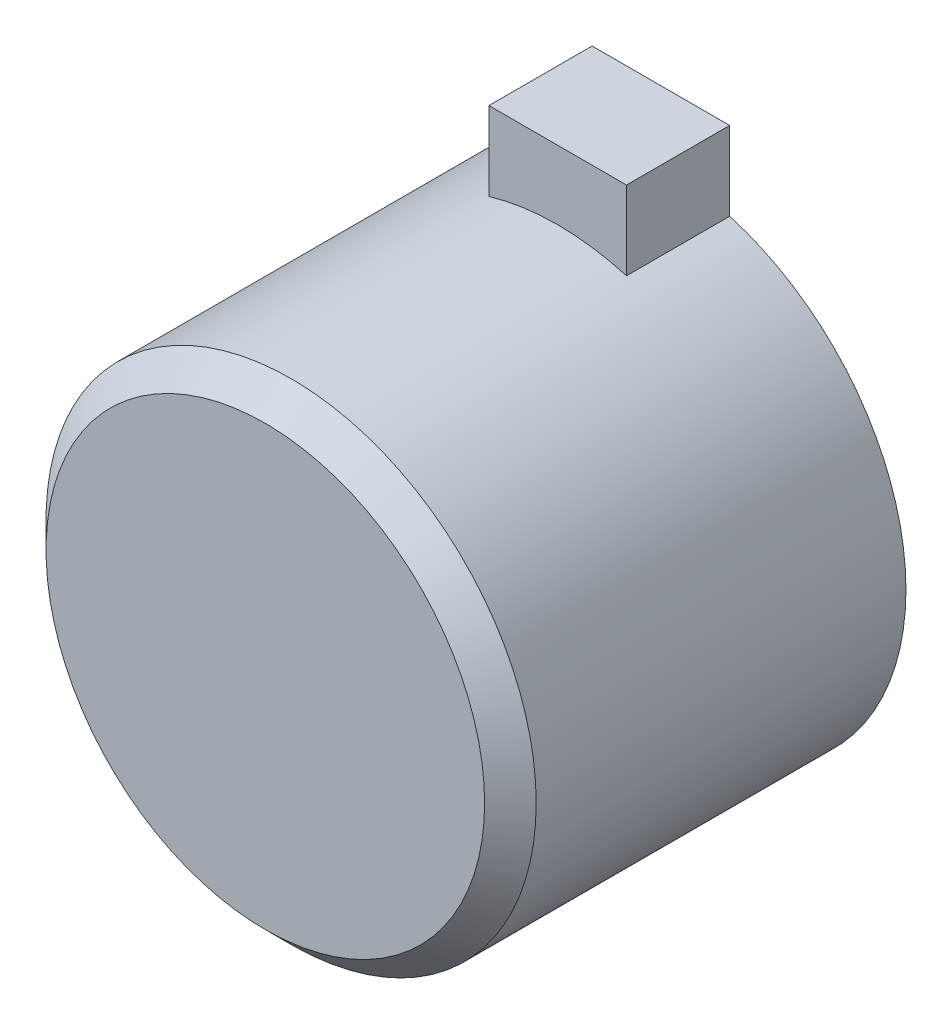
ISO-10303-21;
HEADER;
FILE_DESCRIPTION(('STEP AP214'),'2;1');
FILE_NAME('part.step','',(''),(''),'','','');
FILE_SCHEMA(('AUTOMOTIVE_DESIGN { 1 0 10303 214 1 1 1 1 }'));
ENDSEC;
DATA;
#1=APPLICATION_CONTEXT('core data for automotive mechanical design processes');
#2=APPLICATION_PROTOCOL_DEFINITION('international standard','automotive_design',2000,#1);
#3=PRODUCT_CONTEXT('',#1,'mechanical');
#4=PRODUCT('Part','Part','',(#3));
#5=PRODUCT_RELATED_PRODUCT_CATEGORY('part','',(#4));
#6=PRODUCT_DEFINITION_FORMATION('','',#4);
#7=PRODUCT_DEFINITION_CONTEXT('part definition',#1,'design');
#8=PRODUCT_DEFINITION('design','',#6,#7);
#9=PRODUCT_DEFINITION_SHAPE('','',#8);
#10=(LENGTH_UNIT() NAMED_UNIT(*) SI_UNIT(.MILLI.,.METRE.));
#11=(NAMED_UNIT(*) PLANE_ANGLE_UNIT() SI_UNIT($,.RADIAN.));
#12=(NAMED_UNIT(*) SI_UNIT($,.STERADIAN.) SOLID_ANGLE_UNIT());
#13=UNCERTAINTY_MEASURE_WITH_UNIT(LENGTH_MEASURE(1.E-05),#10,'distance_accuracy_value','');
#14=(GEOMETRIC_REPRESENTATION_CONTEXT(3) GLOBAL_UNCERTAINTY_ASSIGNED_CONTEXT((#13)) GLOBAL_UNIT_ASSIGNED_CONTEXT((#10,
#11,#12)) REPRESENTATION_CONTEXT('',''));
#15=CARTESIAN_POINT('',(0.,0.,0.));
#16=DIRECTION('',(0.,0.,1.));
#17=DIRECTION('',(1.,0.,0.));
#18=AXIS2_PLACEMENT_3D('',#15,#16,#17);
#19=CARTESIAN_POINT('',(0.,0.,10.));
#20=DIRECTION('',(0.,0.,1.));
#21=DIRECTION('',(1.,0.,0.));
#22=AXIS2_PLACEMENT_3D('',#19,#20,#21);
#23=CYLINDRICAL_SURFACE('',#22,28.5);
#24=CARTESIAN_POINT('',(0.,0.,-3.));
#25=DIRECTION('',(0.,0.,1.));
#26=DIRECTION('',(1.,0.,0.));
#27=AXIS2_PLACEMENT_3D('',#24,#25,#26);
#28=CIRCLE('',#27,28.5);
#29=CARTESIAN_POINT('',(28.5,0.,-3.));
#30=VERTEX_POINT('',#29);
#31=EDGE_CURVE('E137',#30,#30,#28,.T.);
#32=ORIENTED_EDGE('',*,*,#31,.F.);
#33=EDGE_LOOP('',(#32));
#34=FACE_BOUND('',#33,.T.);
#35=CARTESIAN_POINT('',(0.,0.,-34.));
#36=DIRECTION('',(0.,0.,1.));
#37=DIRECTION('',(1.,0.,0.));
#38=AXIS2_PLACEMENT_3D('',#35,#36,#37);
#39=CIRCLE('',#38,28.5);
#40=CARTESIAN_POINT('',(-8.,27.3541587331799,-34.));
#41=VERTEX_POINT('',#40);
#42=CARTESIAN_POINT('',(8.,27.3541587331799,-34.));
#43=VERTEX_POINT('',#42);
#44=EDGE_CURVE('E11',#41,#43,#39,.F.);
#45=ORIENTED_EDGE('',*,*,#44,.F.);
#46=DIRECTION('',(0.,0.,1.));
#47=VECTOR('',#46,1.);
#48=CARTESIAN_POINT('',(-8.,27.3541587331799,10.));
#49=LINE('',#48,#47);
#50=CARTESIAN_POINT('',(-8.,27.3541587331799,-46.));
#51=VERTEX_POINT('',#50);
#52=EDGE_CURVE('E57',#41,#51,#49,.F.);
#53=ORIENTED_EDGE('',*,*,#52,.T.);
#54=CARTESIAN_POINT('',(0.,0.,-46.));
#55=DIRECTION('',(0.,0.,1.));
#56=DIRECTION('',(1.,0.,0.));
#57=AXIS2_PLACEMENT_3D('',#54,#55,#56);
#58=CIRCLE('',#57,28.5);
#59=CARTESIAN_POINT('',(8.,27.3541587331799,-46.));
#60=VERTEX_POINT('',#59);
#61=EDGE_CURVE('E135',#51,#60,#58,.T.);
#62=ORIENTED_EDGE('',*,*,#61,.T.);
#63=DIRECTION('',(0.,0.,1.));
#64=VECTOR('',#63,1.);
#65=CARTESIAN_POINT('',(8.,27.3541587331799,10.));
#66=LINE('',#65,#64);
#67=EDGE_CURVE('E91',#60,#43,#66,.T.);
#68=ORIENTED_EDGE('',*,*,#67,.T.);
#69=EDGE_LOOP('',(#45,#53,#62,#68));
#70=FACE_BOUND('',#69,.T.);
#71=ADVANCED_FACE('F39',(#34,#70),#23,.T.);
#72=CARTESIAN_POINT('',(0.,0.,0.));
#73=DIRECTION('',(0.,0.,1.));
#74=DIRECTION('',(1.,0.,0.));
#75=AXIS2_PLACEMENT_3D('',#72,#73,#74);
#76=PLANE('',#75);
#77=CARTESIAN_POINT('',(0.,0.,0.));
#78=DIRECTION('',(0.,0.,1.));
#79=DIRECTION('',(1.,0.,0.));
#80=AXIS2_PLACEMENT_3D('',#77,#78,#79);
#81=CIRCLE('',#80,25.5);
#82=CARTESIAN_POINT('',(25.5,0.,0.));
#83=VERTEX_POINT('',#82);
#84=EDGE_CURVE('E50',#83,#83,#81,.T.);
#85=ORIENTED_EDGE('',*,*,#84,.T.);
#86=EDGE_LOOP('',(#85));
#87=FACE_BOUND('',#86,.T.);
#88=ADVANCED_FACE('F41',(#87),#76,.T.);
#89=CARTESIAN_POINT('',(0.,0.,0.));
#90=DIRECTION('',(0.,0.,-1.));
#91=DIRECTION('',(-1.,0.,0.));
#92=AXIS2_PLACEMENT_3D('',#89,#90,#91);
#93=CONICAL_SURFACE('',#92,25.5,0.785398163397448);
#94=ORIENTED_EDGE('',*,*,#31,.T.);
#95=EDGE_LOOP('',(#94));
#96=FACE_BOUND('',#95,.T.);
#97=ORIENTED_EDGE('',*,*,#84,.F.);
#98=EDGE_LOOP('',(#97));
#99=FACE_BOUND('',#98,.T.);
#100=ADVANCED_FACE('F141',(#96,#99),#93,.T.);
#101=CARTESIAN_POINT('',(25.5,0.,-46.));
#102=DIRECTION('',(0.,0.,-1.));
#103=DIRECTION('',(-1.,0.,0.));
#104=AXIS2_PLACEMENT_3D('',#101,#102,#103);
#105=PLANE('',#104);
#106=ORIENTED_EDGE('',*,*,#61,.F.);
#107=DIRECTION('',(0.,-1.,0.));
#108=VECTOR('',#107,1.);
#109=CARTESIAN_POINT('',(-8.,36.5,-46.));
#110=LINE('',#109,#108);
#111=CARTESIAN_POINT('',(-8.,36.5,-46.));
#112=VERTEX_POINT('',#111);
#113=EDGE_CURVE('E103',#112,#51,#110,.T.);
#114=ORIENTED_EDGE('',*,*,#113,.F.);
#115=DIRECTION('',(-1.,0.,0.));
#116=VECTOR('',#115,1.);
#117=CARTESIAN_POINT('',(8.,36.5,-46.));
#118=LINE('',#117,#116);
#119=CARTESIAN_POINT('',(8.,36.5,-46.));
#120=VERTEX_POINT('',#119);
#121=EDGE_CURVE('E110',#120,#112,#118,.T.);
#122=ORIENTED_EDGE('',*,*,#121,.F.);
#123=DIRECTION('',(0.,1.,0.));
#124=VECTOR('',#123,1.);
#125=CARTESIAN_POINT('',(8.,24.5,-46.));
#126=LINE('',#125,#124);
#127=EDGE_CURVE('E89',#60,#120,#126,.T.);
#128=ORIENTED_EDGE('',*,*,#127,.F.);
#129=EDGE_LOOP('',(#106,#114,#122,#128));
#130=FACE_BOUND('',#129,.T.);
#131=CARTESIAN_POINT('',(0.,23.,-46.));
#132=DIRECTION('',(0.,0.,1.));
#133=DIRECTION('',(0.,1.,0.));
#134=AXIS2_PLACEMENT_3D('',#131,#132,#133);
#135=CIRCLE('',#134,1.25);
#136=CARTESIAN_POINT('',(0.,24.25,-46.));
#137=VERTEX_POINT('',#136);
#138=EDGE_CURVE('E119',#137,#137,#135,.T.);
#139=ORIENTED_EDGE('',*,*,#138,.T.);
#140=EDGE_LOOP('',(#139));
#141=FACE_BOUND('',#140,.T.);
#142=CARTESIAN_POINT('',(-23.,0.,-46.));
#143=DIRECTION('',(0.,0.,1.));
#144=DIRECTION('',(-1.,0.,0.));
#145=AXIS2_PLACEMENT_3D('',#142,#143,#144);
#146=CIRCLE('',#145,1.25);
#147=CARTESIAN_POINT('',(-24.25,0.,-46.));
#148=VERTEX_POINT('',#147);
#149=EDGE_CURVE('E122',#148,#148,#146,.T.);
#150=ORIENTED_EDGE('',*,*,#149,.T.);
#151=EDGE_LOOP('',(#150));
#152=FACE_BOUND('',#151,.T.);
#153=CARTESIAN_POINT('',(0.,-23.,-46.));
#154=DIRECTION('',(0.,0.,1.));
#155=DIRECTION('',(0.,-1.,0.));
#156=AXIS2_PLACEMENT_3D('',#153,#154,#155);
#157=CIRCLE('',#156,1.25);
#158=CARTESIAN_POINT('',(0.,-24.25,-46.));
#159=VERTEX_POINT('',#158);
#160=EDGE_CURVE('E112',#159,#159,#157,.T.);
#161=ORIENTED_EDGE('',*,*,#160,.T.);
#162=EDGE_LOOP('',(#161));
#163=FACE_BOUND('',#162,.T.);
#164=CARTESIAN_POINT('',(23.,0.,-46.));
#165=DIRECTION('',(0.,0.,1.));
#166=DIRECTION('',(1.,0.,0.));
#167=AXIS2_PLACEMENT_3D('',#164,#165,#166);
#168=CIRCLE('',#167,1.25);
#169=CARTESIAN_POINT('',(24.25,0.,-46.));
#170=VERTEX_POINT('',#169);
#171=EDGE_CURVE('E113',#170,#170,#168,.T.);
#172=ORIENTED_EDGE('',*,*,#171,.T.);
#173=EDGE_LOOP('',(#172));
#174=FACE_BOUND('',#173,.T.);
#175=ADVANCED_FACE('F144',(#130,#141,#152,#163,#174),#105,.T.);
#176=CARTESIAN_POINT('',(23.,0.,-38.));
#177=DIRECTION('',(0.,0.,-1.));
#178=DIRECTION('',(-1.,0.,0.));
#179=AXIS2_PLACEMENT_3D('',#176,#177,#178);
#180=CYLINDRICAL_SURFACE('',#179,1.25);
#181=CARTESIAN_POINT('',(23.,0.,-38.));
#182=DIRECTION('',(0.,0.,1.));
#183=DIRECTION('',(1.,0.,0.));
#184=AXIS2_PLACEMENT_3D('',#181,#182,#183);
#185=CIRCLE('',#184,1.25);
#186=CARTESIAN_POINT('',(24.25,0.,-38.));
#187=VERTEX_POINT('',#186);
#188=EDGE_CURVE('E128',#187,#187,#185,.T.);
#189=ORIENTED_EDGE('',*,*,#188,.T.);
#190=EDGE_LOOP('',(#189));
#191=FACE_BOUND('',#190,.T.);
#192=ORIENTED_EDGE('',*,*,#171,.F.);
#193=EDGE_LOOP('',(#192));
#194=FACE_BOUND('',#193,.T.);
#195=ADVANCED_FACE('F155',(#191,#194),#180,.F.);
#196=CARTESIAN_POINT('',(23.,0.,-38.));
#197=DIRECTION('',(0.,0.,1.));
#198=DIRECTION('',(1.,0.,0.));
#199=AXIS2_PLACEMENT_3D('',#196,#197,#198);
#200=PLANE('',#199);
#201=ORIENTED_EDGE('',*,*,#188,.F.);
#202=EDGE_LOOP('',(#201));
#203=FACE_BOUND('',#202,.T.);
#204=ADVANCED_FACE('F163',(#203),#200,.F.);
#205=CARTESIAN_POINT('',(0.,-23.,-38.));
#206=DIRECTION('',(0.,0.,-1.));
#207=DIRECTION('',(-1.,0.,0.));
#208=AXIS2_PLACEMENT_3D('',#205,#206,#207);
#209=CYLINDRICAL_SURFACE('',#208,1.25);
#210=CARTESIAN_POINT('',(0.,-23.,-38.));
#211=DIRECTION('',(0.,0.,1.));
#212=DIRECTION('',(0.,-1.,0.));
#213=AXIS2_PLACEMENT_3D('',#210,#211,#212);
#214=CIRCLE('',#213,1.25);
#215=CARTESIAN_POINT('',(0.,-24.25,-38.));
#216=VERTEX_POINT('',#215);
#217=EDGE_CURVE('E125',#216,#216,#214,.T.);
#218=ORIENTED_EDGE('',*,*,#217,.T.);
#219=EDGE_LOOP('',(#218));
#220=FACE_BOUND('',#219,.T.);
#221=ORIENTED_EDGE('',*,*,#160,.F.);
#222=EDGE_LOOP('',(#221));
#223=FACE_BOUND('',#222,.T.);
#224=ADVANCED_FACE('F169',(#220,#223),#209,.F.);
#225=CARTESIAN_POINT('',(0.,-23.,-38.));
#226=DIRECTION('',(0.,0.,1.));
#227=DIRECTION('',(0.,-1.,0.));
#228=AXIS2_PLACEMENT_3D('',#225,#226,#227);
#229=PLANE('',#228);
#230=ORIENTED_EDGE('',*,*,#217,.F.);
#231=EDGE_LOOP('',(#230));
#232=FACE_BOUND('',#231,.T.);
#233=ADVANCED_FACE('F171',(#232),#229,.F.);
#234=CARTESIAN_POINT('',(-23.,0.,-38.));
#235=DIRECTION('',(0.,0.,-1.));
#236=DIRECTION('',(-1.,0.,0.));
#237=AXIS2_PLACEMENT_3D('',#234,#235,#236);
#238=CYLINDRICAL_SURFACE('',#237,1.25);
#239=CARTESIAN_POINT('',(-23.,0.,-38.));
#240=DIRECTION('',(0.,0.,1.));
#241=DIRECTION('',(-1.,0.,0.));
#242=AXIS2_PLACEMENT_3D('',#239,#240,#241);
#243=CIRCLE('',#242,1.25);
#244=CARTESIAN_POINT('',(-24.25,0.,-38.));
#245=VERTEX_POINT('',#244);
#246=EDGE_CURVE('E118',#245,#245,#243,.T.);
#247=ORIENTED_EDGE('',*,*,#246,.T.);
#248=EDGE_LOOP('',(#247));
#249=FACE_BOUND('',#248,.T.);
#250=ORIENTED_EDGE('',*,*,#149,.F.);
#251=EDGE_LOOP('',(#250));
#252=FACE_BOUND('',#251,.T.);
#253=ADVANCED_FACE('F176',(#249,#252),#238,.F.);
#254=CARTESIAN_POINT('',(-23.,0.,-38.));
#255=DIRECTION('',(0.,0.,1.));
#256=DIRECTION('',(-1.,0.,0.));
#257=AXIS2_PLACEMENT_3D('',#254,#255,#256);
#258=PLANE('',#257);
#259=ORIENTED_EDGE('',*,*,#246,.F.);
#260=EDGE_LOOP('',(#259));
#261=FACE_BOUND('',#260,.T.);
#262=ADVANCED_FACE('F180',(#261),#258,.F.);
#263=CARTESIAN_POINT('',(0.,23.,-38.));
#264=DIRECTION('',(0.,0.,-1.));
#265=DIRECTION('',(-1.,0.,0.));
#266=AXIS2_PLACEMENT_3D('',#263,#264,#265);
#267=CYLINDRICAL_SURFACE('',#266,1.25);
#268=CARTESIAN_POINT('',(0.,23.,-38.));
#269=DIRECTION('',(0.,0.,1.));
#270=DIRECTION('',(0.,1.,0.));
#271=AXIS2_PLACEMENT_3D('',#268,#269,#270);
#272=CIRCLE('',#271,1.25);
#273=CARTESIAN_POINT('',(0.,24.25,-38.));
#274=VERTEX_POINT('',#273);
#275=EDGE_CURVE('E115',#274,#274,#272,.T.);
#276=ORIENTED_EDGE('',*,*,#275,.T.);
#277=EDGE_LOOP('',(#276));
#278=FACE_BOUND('',#277,.T.);
#279=ORIENTED_EDGE('',*,*,#138,.F.);
#280=EDGE_LOOP('',(#279));
#281=FACE_BOUND('',#280,.T.);
#282=ADVANCED_FACE('F184',(#278,#281),#267,.F.);
#283=CARTESIAN_POINT('',(0.,23.,-38.));
#284=DIRECTION('',(0.,0.,1.));
#285=DIRECTION('',(0.,1.,0.));
#286=AXIS2_PLACEMENT_3D('',#283,#284,#285);
#287=PLANE('',#286);
#288=ORIENTED_EDGE('',*,*,#275,.F.);
#289=EDGE_LOOP('',(#288));
#290=FACE_BOUND('',#289,.T.);
#291=ADVANCED_FACE('F190',(#290),#287,.F.);
#292=CARTESIAN_POINT('',(-8.,36.5,-34.));
#293=DIRECTION('',(1.,0.,0.));
#294=DIRECTION('',(0.,0.,-1.));
#295=AXIS2_PLACEMENT_3D('',#292,#293,#294);
#296=PLANE('',#295);
#297=ORIENTED_EDGE('',*,*,#52,.F.);
#298=DIRECTION('',(0.,-1.,0.));
#299=VECTOR('',#298,1.);
#300=CARTESIAN_POINT('',(-8.,36.5,-34.));
#301=LINE('',#300,#299);
#302=CARTESIAN_POINT('',(-8.,36.5,-34.));
#303=VERTEX_POINT('',#302);
#304=EDGE_CURVE('E83',#303,#41,#301,.T.);
#305=ORIENTED_EDGE('',*,*,#304,.F.);
#306=DIRECTION('',(0.,0.,-1.));
#307=VECTOR('',#306,1.);
#308=CARTESIAN_POINT('',(-8.,36.5,-34.));
#309=LINE('',#308,#307);
#310=EDGE_CURVE('E94',#303,#112,#309,.T.);
#311=ORIENTED_EDGE('',*,*,#310,.T.);
#312=ORIENTED_EDGE('',*,*,#113,.T.);
#313=EDGE_LOOP('',(#297,#305,#311,#312));
#314=FACE_BOUND('',#313,.T.);
#315=ADVANCED_FACE('F191',(#314),#296,.F.);
#316=CARTESIAN_POINT('',(8.,24.5,-34.));
#317=DIRECTION('',(-1.,0.,0.));
#318=DIRECTION('',(0.,0.,1.));
#319=AXIS2_PLACEMENT_3D('',#316,#317,#318);
#320=PLANE('',#319);
#321=ORIENTED_EDGE('',*,*,#67,.F.);
#322=ORIENTED_EDGE('',*,*,#127,.T.);
#323=DIRECTION('',(0.,0.,-1.));
#324=VECTOR('',#323,1.);
#325=CARTESIAN_POINT('',(8.,36.5,-34.));
#326=LINE('',#325,#324);
#327=CARTESIAN_POINT('',(8.,36.5,-34.));
#328=VERTEX_POINT('',#327);
#329=EDGE_CURVE('E87',#328,#120,#326,.T.);
#330=ORIENTED_EDGE('',*,*,#329,.F.);
#331=DIRECTION('',(0.,1.,0.));
#332=VECTOR('',#331,1.);
#333=CARTESIAN_POINT('',(8.,24.5,-34.));
#334=LINE('',#333,#332);
#335=EDGE_CURVE('E73',#43,#328,#334,.T.);
#336=ORIENTED_EDGE('',*,*,#335,.F.);
#337=EDGE_LOOP('',(#321,#322,#330,#336));
#338=FACE_BOUND('',#337,.T.);
#339=ADVANCED_FACE('F86',(#338),#320,.F.);
#340=CARTESIAN_POINT('',(8.,36.5,-34.));
#341=DIRECTION('',(0.,-1.,0.));
#342=DIRECTION('',(0.,0.,-1.));
#343=AXIS2_PLACEMENT_3D('',#340,#341,#342);
#344=PLANE('',#343);
#345=ORIENTED_EDGE('',*,*,#121,.T.);
#346=ORIENTED_EDGE('',*,*,#310,.F.);
#347=DIRECTION('',(-1.,0.,0.));
#348=VECTOR('',#347,1.);
#349=CARTESIAN_POINT('',(8.,36.5,-34.));
#350=LINE('',#349,#348);
#351=EDGE_CURVE('E77',#328,#303,#350,.T.);
#352=ORIENTED_EDGE('',*,*,#351,.F.);
#353=ORIENTED_EDGE('',*,*,#329,.T.);
#354=EDGE_LOOP('',(#345,#346,#352,#353));
#355=FACE_BOUND('',#354,.T.);
#356=ADVANCED_FACE('F96',(#355),#344,.F.);
#357=CARTESIAN_POINT('',(0.,0.,-34.));
#358=DIRECTION('',(0.,0.,1.));
#359=DIRECTION('',(1.,0.,0.));
#360=AXIS2_PLACEMENT_3D('',#357,#358,#359);
#361=PLANE('',#360);
#362=ORIENTED_EDGE('',*,*,#304,.T.);
#363=ORIENTED_EDGE('',*,*,#44,.T.);
#364=ORIENTED_EDGE('',*,*,#335,.T.);
#365=ORIENTED_EDGE('',*,*,#351,.T.);
#366=EDGE_LOOP('',(#362,#363,#364,#365));
#367=FACE_BOUND('',#366,.T.);
#368=ADVANCED_FACE('F80',(#367),#361,.T.);
#369=CLOSED_SHELL('',(#71,#88,#100,#175,#195,#204,#224,#233,#253,#262,#282,#291,#315,#339,#356,#368));
#370=MANIFOLD_SOLID_BREP('B2',#369);
#371=ADVANCED_BREP_SHAPE_REPRESENTATION('',(#18,#370),#14);
#372=SHAPE_DEFINITION_REPRESENTATION(#9,#371);
ENDSEC;
END-ISO-10303-21;
